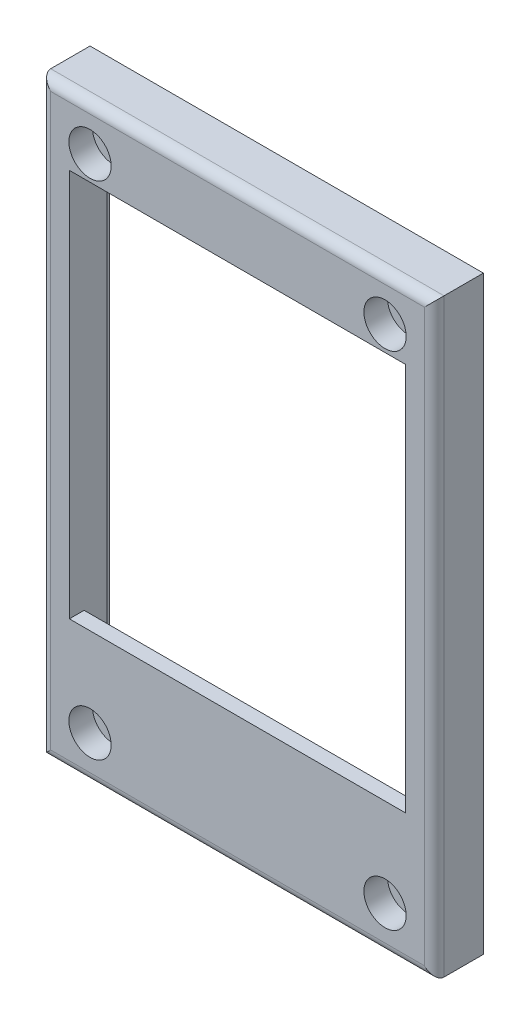
ISO-10303-21;
HEADER;
FILE_DESCRIPTION(('STEP AP214'),'2;1');
FILE_NAME('part.step','',(''),(''),'','','');
FILE_SCHEMA(('AUTOMOTIVE_DESIGN { 1 0 10303 214 1 1 1 1 }'));
ENDSEC;
DATA;
#1=APPLICATION_CONTEXT('core data for automotive mechanical design processes');
#2=APPLICATION_PROTOCOL_DEFINITION('international standard','automotive_design',2000,#1);
#3=PRODUCT_CONTEXT('',#1,'mechanical');
#4=PRODUCT('Part','Part','',(#3));
#5=PRODUCT_RELATED_PRODUCT_CATEGORY('part','',(#4));
#6=PRODUCT_DEFINITION_FORMATION('','',#4);
#7=PRODUCT_DEFINITION_CONTEXT('part definition',#1,'design');
#8=PRODUCT_DEFINITION('design','',#6,#7);
#9=PRODUCT_DEFINITION_SHAPE('','',#8);
#10=(LENGTH_UNIT() NAMED_UNIT(*) SI_UNIT(.MILLI.,.METRE.));
#11=(NAMED_UNIT(*) PLANE_ANGLE_UNIT() SI_UNIT($,.RADIAN.));
#12=(NAMED_UNIT(*) SI_UNIT($,.STERADIAN.) SOLID_ANGLE_UNIT());
#13=UNCERTAINTY_MEASURE_WITH_UNIT(LENGTH_MEASURE(1.E-05),#10,'distance_accuracy_value','');
#14=(GEOMETRIC_REPRESENTATION_CONTEXT(3) GLOBAL_UNCERTAINTY_ASSIGNED_CONTEXT((#13)) GLOBAL_UNIT_ASSIGNED_CONTEXT((#10,
#11,#12)) REPRESENTATION_CONTEXT('',''));
#15=CARTESIAN_POINT('',(0.,0.,0.));
#16=DIRECTION('',(0.,0.,1.));
#17=DIRECTION('',(1.,0.,0.));
#18=AXIS2_PLACEMENT_3D('',#15,#16,#17);
#19=CARTESIAN_POINT('',(2.9,7.,5.));
#20=DIRECTION('',(-1.,0.,0.));
#21=DIRECTION('',(0.,-1.,0.));
#22=AXIS2_PLACEMENT_3D('',#19,#20,#21);
#23=PLANE('',#22);
#24=DIRECTION('',(0.,0.,1.));
#25=VECTOR('',#24,1.);
#26=CARTESIAN_POINT('',(2.9,13.5,5.));
#27=LINE('',#26,#25);
#28=CARTESIAN_POINT('',(2.9,13.5,3.5));
#29=VERTEX_POINT('',#28);
#30=CARTESIAN_POINT('',(2.9,13.5,5.));
#31=VERTEX_POINT('',#30);
#32=EDGE_CURVE('E61',#29,#31,#27,.T.);
#33=ORIENTED_EDGE('',*,*,#32,.F.);
#34=DIRECTION('',(0.,1.,0.));
#35=VECTOR('',#34,1.);
#36=CARTESIAN_POINT('',(2.9,7.,3.5));
#37=LINE('',#36,#35);
#38=CARTESIAN_POINT('',(2.9,7.,3.5));
#39=VERTEX_POINT('',#38);
#40=EDGE_CURVE('E188',#39,#29,#37,.T.);
#41=ORIENTED_EDGE('',*,*,#40,.F.);
#42=DIRECTION('',(0.,0.,-1.));
#43=VECTOR('',#42,1.);
#44=CARTESIAN_POINT('',(2.9,7.,5.));
#45=LINE('',#44,#43);
#46=CARTESIAN_POINT('',(2.9,7.,1.2));
#47=VERTEX_POINT('',#46);
#48=EDGE_CURVE('E178',#39,#47,#45,.T.);
#49=ORIENTED_EDGE('',*,*,#48,.T.);
#50=DIRECTION('',(0.,1.,0.));
#51=VECTOR('',#50,1.);
#52=CARTESIAN_POINT('',(2.9,7.,1.2));
#53=LINE('',#52,#51);
#54=CARTESIAN_POINT('',(2.9,53.,1.2));
#55=VERTEX_POINT('',#54);
#56=EDGE_CURVE('E263',#47,#55,#53,.T.);
#57=ORIENTED_EDGE('',*,*,#56,.T.);
#58=DIRECTION('',(0.,0.,-1.));
#59=VECTOR('',#58,1.);
#60=CARTESIAN_POINT('',(2.9,53.,5.));
#61=LINE('',#60,#59);
#62=CARTESIAN_POINT('',(2.9,53.,5.));
#63=VERTEX_POINT('',#62);
#64=EDGE_CURVE('E187',#63,#55,#61,.T.);
#65=ORIENTED_EDGE('',*,*,#64,.F.);
#66=DIRECTION('',(0.,1.,0.));
#67=VECTOR('',#66,1.);
#68=CARTESIAN_POINT('',(2.9,7.,5.));
#69=LINE('',#68,#67);
#70=EDGE_CURVE('E316',#31,#63,#69,.T.);
#71=ORIENTED_EDGE('',*,*,#70,.F.);
#72=EDGE_LOOP('',(#33,#41,#49,#57,#65,#71));
#73=FACE_BOUND('',#72,.T.);
#74=ADVANCED_FACE('F39',(#73),#23,.F.);
#75=CARTESIAN_POINT('',(2.9,7.,5.));
#76=DIRECTION('',(0.,-1.,0.));
#77=DIRECTION('',(0.,0.,-1.));
#78=AXIS2_PLACEMENT_3D('',#75,#76,#77);
#79=PLANE('',#78);
#80=DIRECTION('',(-1.,0.,0.));
#81=VECTOR('',#80,1.);
#82=CARTESIAN_POINT('',(40.002,6.99999999999999,3.5));
#83=LINE('',#82,#81);
#84=CARTESIAN_POINT('',(37.1,7.,3.5));
#85=VERTEX_POINT('',#84);
#86=EDGE_CURVE('E181',#85,#39,#83,.T.);
#87=ORIENTED_EDGE('',*,*,#86,.F.);
#88=DIRECTION('',(0.,0.,-1.));
#89=VECTOR('',#88,1.);
#90=CARTESIAN_POINT('',(37.1,7.,5.));
#91=LINE('',#90,#89);
#92=CARTESIAN_POINT('',(37.1,7.,1.2));
#93=VERTEX_POINT('',#92);
#94=EDGE_CURVE('E190',#85,#93,#91,.T.);
#95=ORIENTED_EDGE('',*,*,#94,.T.);
#96=DIRECTION('',(-1.,0.,0.));
#97=VECTOR('',#96,1.);
#98=CARTESIAN_POINT('',(2.9,7.,1.2));
#99=LINE('',#98,#97);
#100=EDGE_CURVE('E182',#93,#47,#99,.T.);
#101=ORIENTED_EDGE('',*,*,#100,.T.);
#102=ORIENTED_EDGE('',*,*,#48,.F.);
#103=EDGE_LOOP('',(#87,#95,#101,#102));
#104=FACE_BOUND('',#103,.T.);
#105=ADVANCED_FACE('F177',(#104),#79,.F.);
#106=CARTESIAN_POINT('',(5.00000000000001,4.5,0.));
#107=DIRECTION('',(0.,0.,1.));
#108=DIRECTION('',(1.,0.,0.));
#109=AXIS2_PLACEMENT_3D('',#106,#107,#108);
#110=CYLINDRICAL_SURFACE('',#109,1.15);
#111=CARTESIAN_POINT('',(5.00000000000001,4.5,1.2));
#112=DIRECTION('',(0.,0.,1.));
#113=DIRECTION('',(1.,0.,0.));
#114=AXIS2_PLACEMENT_3D('',#111,#112,#113);
#115=CIRCLE('',#114,1.15);
#116=CARTESIAN_POINT('',(6.15000000000001,4.5,1.2));
#117=VERTEX_POINT('',#116);
#118=EDGE_CURVE('E289',#117,#117,#115,.F.);
#119=ORIENTED_EDGE('',*,*,#118,.T.);
#120=EDGE_LOOP('',(#119));
#121=FACE_BOUND('',#120,.T.);
#122=CARTESIAN_POINT('',(5.00000000000001,4.5,2.6));
#123=DIRECTION('',(0.,0.,1.));
#124=DIRECTION('',(1.,0.,0.));
#125=AXIS2_PLACEMENT_3D('',#122,#123,#124);
#126=CIRCLE('',#125,1.15);
#127=CARTESIAN_POINT('',(6.15000000000001,4.5,2.6));
#128=VERTEX_POINT('',#127);
#129=EDGE_CURVE('E318',#128,#128,#126,.F.);
#130=ORIENTED_EDGE('',*,*,#129,.F.);
#131=EDGE_LOOP('',(#130));
#132=FACE_BOUND('',#131,.T.);
#133=ADVANCED_FACE('F459',(#121,#132),#110,.F.);
#134=CARTESIAN_POINT('',(35.,55.5,0.));
#135=DIRECTION('',(0.,0.,1.));
#136=DIRECTION('',(1.,0.,0.));
#137=AXIS2_PLACEMENT_3D('',#134,#135,#136);
#138=CYLINDRICAL_SURFACE('',#137,1.15);
#139=CARTESIAN_POINT('',(35.,55.5,1.2));
#140=DIRECTION('',(0.,0.,1.));
#141=DIRECTION('',(1.,0.,0.));
#142=AXIS2_PLACEMENT_3D('',#139,#140,#141);
#143=CIRCLE('',#142,1.15);
#144=CARTESIAN_POINT('',(36.15,55.5,1.2));
#145=VERTEX_POINT('',#144);
#146=EDGE_CURVE('E283',#145,#145,#143,.F.);
#147=ORIENTED_EDGE('',*,*,#146,.T.);
#148=EDGE_LOOP('',(#147));
#149=FACE_BOUND('',#148,.T.);
#150=CARTESIAN_POINT('',(35.,55.5,2.6));
#151=DIRECTION('',(0.,0.,1.));
#152=DIRECTION('',(1.,0.,0.));
#153=AXIS2_PLACEMENT_3D('',#150,#151,#152);
#154=CIRCLE('',#153,1.15);
#155=CARTESIAN_POINT('',(36.15,55.5,2.6));
#156=VERTEX_POINT('',#155);
#157=EDGE_CURVE('E358',#156,#156,#154,.F.);
#158=ORIENTED_EDGE('',*,*,#157,.F.);
#159=EDGE_LOOP('',(#158));
#160=FACE_BOUND('',#159,.T.);
#161=ADVANCED_FACE('F465',(#149,#160),#138,.F.);
#162=CARTESIAN_POINT('',(5.00000000000001,55.5,0.));
#163=DIRECTION('',(0.,0.,1.));
#164=DIRECTION('',(1.,0.,0.));
#165=AXIS2_PLACEMENT_3D('',#162,#163,#164);
#166=CYLINDRICAL_SURFACE('',#165,1.15);
#167=CARTESIAN_POINT('',(5.00000000000001,55.5,1.2));
#168=DIRECTION('',(0.,0.,1.));
#169=DIRECTION('',(1.,0.,0.));
#170=AXIS2_PLACEMENT_3D('',#167,#168,#169);
#171=CIRCLE('',#170,1.15);
#172=CARTESIAN_POINT('',(6.15000000000001,55.5,1.2));
#173=VERTEX_POINT('',#172);
#174=EDGE_CURVE('E285',#173,#173,#171,.F.);
#175=ORIENTED_EDGE('',*,*,#174,.T.);
#176=EDGE_LOOP('',(#175));
#177=FACE_BOUND('',#176,.T.);
#178=CARTESIAN_POINT('',(5.00000000000001,55.5,2.6));
#179=DIRECTION('',(0.,0.,1.));
#180=DIRECTION('',(1.,0.,0.));
#181=AXIS2_PLACEMENT_3D('',#178,#179,#180);
#182=CIRCLE('',#181,1.15);
#183=CARTESIAN_POINT('',(6.15000000000001,55.5,2.6));
#184=VERTEX_POINT('',#183);
#185=EDGE_CURVE('E354',#184,#184,#182,.F.);
#186=ORIENTED_EDGE('',*,*,#185,.F.);
#187=EDGE_LOOP('',(#186));
#188=FACE_BOUND('',#187,.T.);
#189=ADVANCED_FACE('F461',(#177,#188),#166,.F.);
#190=CARTESIAN_POINT('',(35.,4.5,0.));
#191=DIRECTION('',(0.,0.,1.));
#192=DIRECTION('',(1.,0.,0.));
#193=AXIS2_PLACEMENT_3D('',#190,#191,#192);
#194=CYLINDRICAL_SURFACE('',#193,1.15);
#195=CARTESIAN_POINT('',(35.,4.5,1.2));
#196=DIRECTION('',(0.,0.,1.));
#197=DIRECTION('',(1.,0.,0.));
#198=AXIS2_PLACEMENT_3D('',#195,#196,#197);
#199=CIRCLE('',#198,1.15);
#200=CARTESIAN_POINT('',(36.15,4.5,1.2));
#201=VERTEX_POINT('',#200);
#202=EDGE_CURVE('E276',#201,#201,#199,.F.);
#203=ORIENTED_EDGE('',*,*,#202,.T.);
#204=EDGE_LOOP('',(#203));
#205=FACE_BOUND('',#204,.T.);
#206=CARTESIAN_POINT('',(35.,4.5,2.6));
#207=DIRECTION('',(0.,0.,1.));
#208=DIRECTION('',(1.,0.,0.));
#209=AXIS2_PLACEMENT_3D('',#206,#207,#208);
#210=CIRCLE('',#209,1.15);
#211=CARTESIAN_POINT('',(36.15,4.5,2.6));
#212=VERTEX_POINT('',#211);
#213=EDGE_CURVE('E312',#212,#212,#210,.F.);
#214=ORIENTED_EDGE('',*,*,#213,.F.);
#215=EDGE_LOOP('',(#214));
#216=FACE_BOUND('',#215,.T.);
#217=ADVANCED_FACE('F470',(#205,#216),#194,.F.);
#218=CARTESIAN_POINT('',(0.,0.,5.));
#219=DIRECTION('',(0.,1.,0.));
#220=DIRECTION('',(-1.,0.,0.));
#221=AXIS2_PLACEMENT_3D('',#218,#219,#220);
#222=PLANE('',#221);
#223=DIRECTION('',(0.,0.,-1.));
#224=VECTOR('',#223,1.);
#225=CARTESIAN_POINT('',(40.,0.,5.));
#226=LINE('',#225,#224);
#227=CARTESIAN_POINT('',(40.,0.,4.));
#228=VERTEX_POINT('',#227);
#229=CARTESIAN_POINT('',(40.,0.,0.));
#230=VERTEX_POINT('',#229);
#231=EDGE_CURVE('E346',#228,#230,#226,.T.);
#232=ORIENTED_EDGE('',*,*,#231,.F.);
#233=DIRECTION('',(1.,0.,0.));
#234=VECTOR('',#233,1.);
#235=CARTESIAN_POINT('',(0.,0.,4.));
#236=LINE('',#235,#234);
#237=CARTESIAN_POINT('',(0.,0.,4.));
#238=VERTEX_POINT('',#237);
#239=EDGE_CURVE('E371',#228,#238,#236,.F.);
#240=ORIENTED_EDGE('',*,*,#239,.T.);
#241=DIRECTION('',(0.,0.,-1.));
#242=VECTOR('',#241,1.);
#243=CARTESIAN_POINT('',(0.,0.,5.));
#244=LINE('',#243,#242);
#245=CARTESIAN_POINT('',(0.,0.,0.));
#246=VERTEX_POINT('',#245);
#247=EDGE_CURVE('E344',#238,#246,#244,.T.);
#248=ORIENTED_EDGE('',*,*,#247,.T.);
#249=DIRECTION('',(1.,0.,0.));
#250=VECTOR('',#249,1.);
#251=CARTESIAN_POINT('',(0.,0.,0.));
#252=LINE('',#251,#250);
#253=EDGE_CURVE('E329',#246,#230,#252,.T.);
#254=ORIENTED_EDGE('',*,*,#253,.T.);
#255=EDGE_LOOP('',(#232,#240,#248,#254));
#256=FACE_BOUND('',#255,.T.);
#257=ADVANCED_FACE('F415',(#256),#222,.F.);
#258=CARTESIAN_POINT('',(40.,0.,5.));
#259=DIRECTION('',(-1.,0.,0.));
#260=DIRECTION('',(0.,0.,1.));
#261=AXIS2_PLACEMENT_3D('',#258,#259,#260);
#262=PLANE('',#261);
#263=DIRECTION('',(0.,0.,-1.));
#264=VECTOR('',#263,1.);
#265=CARTESIAN_POINT('',(40.,60.,5.));
#266=LINE('',#265,#264);
#267=CARTESIAN_POINT('',(40.,60.,4.));
#268=VERTEX_POINT('',#267);
#269=CARTESIAN_POINT('',(40.,60.,0.));
#270=VERTEX_POINT('',#269);
#271=EDGE_CURVE('E350',#268,#270,#266,.T.);
#272=ORIENTED_EDGE('',*,*,#271,.F.);
#273=DIRECTION('',(0.,1.,0.));
#274=VECTOR('',#273,1.);
#275=CARTESIAN_POINT('',(40.,0.,4.));
#276=LINE('',#275,#274);
#277=EDGE_CURVE('E372',#268,#228,#276,.F.);
#278=ORIENTED_EDGE('',*,*,#277,.T.);
#279=ORIENTED_EDGE('',*,*,#231,.T.);
#280=DIRECTION('',(0.,1.,0.));
#281=VECTOR('',#280,1.);
#282=CARTESIAN_POINT('',(40.,0.,0.));
#283=LINE('',#282,#281);
#284=EDGE_CURVE('E331',#230,#270,#283,.T.);
#285=ORIENTED_EDGE('',*,*,#284,.T.);
#286=EDGE_LOOP('',(#272,#278,#279,#285));
#287=FACE_BOUND('',#286,.T.);
#288=ADVANCED_FACE('F398',(#287),#262,.F.);
#289=CARTESIAN_POINT('',(0.,60.,5.));
#290=DIRECTION('',(0.,-1.,0.));
#291=DIRECTION('',(1.,0.,0.));
#292=AXIS2_PLACEMENT_3D('',#289,#290,#291);
#293=PLANE('',#292);
#294=DIRECTION('',(0.,0.,-1.));
#295=VECTOR('',#294,1.);
#296=CARTESIAN_POINT('',(0.,60.,5.));
#297=LINE('',#296,#295);
#298=CARTESIAN_POINT('',(0.,60.,4.));
#299=VERTEX_POINT('',#298);
#300=CARTESIAN_POINT('',(0.,60.,0.));
#301=VERTEX_POINT('',#300);
#302=EDGE_CURVE('E343',#299,#301,#297,.T.);
#303=ORIENTED_EDGE('',*,*,#302,.F.);
#304=DIRECTION('',(-1.,0.,0.));
#305=VECTOR('',#304,1.);
#306=CARTESIAN_POINT('',(40.,60.,4.));
#307=LINE('',#306,#305);
#308=EDGE_CURVE('E48',#299,#268,#307,.F.);
#309=ORIENTED_EDGE('',*,*,#308,.T.);
#310=ORIENTED_EDGE('',*,*,#271,.T.);
#311=DIRECTION('',(-1.,0.,0.));
#312=VECTOR('',#311,1.);
#313=CARTESIAN_POINT('',(0.,60.,0.));
#314=LINE('',#313,#312);
#315=EDGE_CURVE('E340',#270,#301,#314,.T.);
#316=ORIENTED_EDGE('',*,*,#315,.T.);
#317=EDGE_LOOP('',(#303,#309,#310,#316));
#318=FACE_BOUND('',#317,.T.);
#319=ADVANCED_FACE('F399',(#318),#293,.F.);
#320=CARTESIAN_POINT('',(0.,0.,5.));
#321=DIRECTION('',(1.,0.,0.));
#322=DIRECTION('',(0.,0.,-1.));
#323=AXIS2_PLACEMENT_3D('',#320,#321,#322);
#324=PLANE('',#323);
#325=ORIENTED_EDGE('',*,*,#247,.F.);
#326=DIRECTION('',(0.,-1.,0.));
#327=VECTOR('',#326,1.);
#328=CARTESIAN_POINT('',(0.,60.,4.));
#329=LINE('',#328,#327);
#330=EDGE_CURVE('E11',#238,#299,#329,.F.);
#331=ORIENTED_EDGE('',*,*,#330,.T.);
#332=ORIENTED_EDGE('',*,*,#302,.T.);
#333=DIRECTION('',(0.,-1.,0.));
#334=VECTOR('',#333,1.);
#335=CARTESIAN_POINT('',(0.,0.,0.));
#336=LINE('',#335,#334);
#337=EDGE_CURVE('E338',#301,#246,#336,.T.);
#338=ORIENTED_EDGE('',*,*,#337,.T.);
#339=EDGE_LOOP('',(#325,#331,#332,#338));
#340=FACE_BOUND('',#339,.T.);
#341=ADVANCED_FACE('F408',(#340),#324,.F.);
#342=CARTESIAN_POINT('',(0.,0.,5.));
#343=DIRECTION('',(0.,0.,1.));
#344=DIRECTION('',(1.,0.,0.));
#345=AXIS2_PLACEMENT_3D('',#342,#343,#344);
#346=PLANE('',#345);
#347=DIRECTION('',(0.,-1.,0.));
#348=VECTOR('',#347,1.);
#349=CARTESIAN_POINT('',(1.,0.,5.));
#350=LINE('',#349,#348);
#351=CARTESIAN_POINT('',(1.,59.,5.));
#352=VERTEX_POINT('',#351);
#353=CARTESIAN_POINT('',(1.,1.,5.));
#354=VERTEX_POINT('',#353);
#355=EDGE_CURVE('E365',#352,#354,#350,.T.);
#356=ORIENTED_EDGE('',*,*,#355,.T.);
#357=DIRECTION('',(1.,0.,0.));
#358=VECTOR('',#357,1.);
#359=CARTESIAN_POINT('',(40.,1.00000000000001,5.));
#360=LINE('',#359,#358);
#361=CARTESIAN_POINT('',(39.,1.,5.));
#362=VERTEX_POINT('',#361);
#363=EDGE_CURVE('E368',#354,#362,#360,.T.);
#364=ORIENTED_EDGE('',*,*,#363,.T.);
#365=DIRECTION('',(0.,1.,0.));
#366=VECTOR('',#365,1.);
#367=CARTESIAN_POINT('',(39.,60.,5.));
#368=LINE('',#367,#366);
#369=CARTESIAN_POINT('',(39.,59.,5.));
#370=VERTEX_POINT('',#369);
#371=EDGE_CURVE('E366',#362,#370,#368,.T.);
#372=ORIENTED_EDGE('',*,*,#371,.T.);
#373=DIRECTION('',(-1.,0.,0.));
#374=VECTOR('',#373,1.);
#375=CARTESIAN_POINT('',(0.,59.,5.));
#376=LINE('',#375,#374);
#377=EDGE_CURVE('E364',#370,#352,#376,.T.);
#378=ORIENTED_EDGE('',*,*,#377,.T.);
#379=EDGE_LOOP('',(#356,#364,#372,#378));
#380=FACE_BOUND('',#379,.T.);
#381=CARTESIAN_POINT('',(35.,55.5,5.));
#382=DIRECTION('',(0.,0.,1.));
#383=DIRECTION('',(1.,0.,0.));
#384=AXIS2_PLACEMENT_3D('',#381,#382,#383);
#385=CIRCLE('',#384,2.15);
#386=CARTESIAN_POINT('',(37.15,55.5,5.));
#387=VERTEX_POINT('',#386);
#388=EDGE_CURVE('E296',#387,#387,#385,.T.);
#389=ORIENTED_EDGE('',*,*,#388,.F.);
#390=EDGE_LOOP('',(#389));
#391=FACE_BOUND('',#390,.T.);
#392=CARTESIAN_POINT('',(5.00000000000001,4.5,5.));
#393=DIRECTION('',(0.,0.,1.));
#394=DIRECTION('',(1.,0.,0.));
#395=AXIS2_PLACEMENT_3D('',#392,#393,#394);
#396=CIRCLE('',#395,2.15);
#397=CARTESIAN_POINT('',(7.15000000000001,4.5,5.));
#398=VERTEX_POINT('',#397);
#399=EDGE_CURVE('E304',#398,#398,#396,.T.);
#400=ORIENTED_EDGE('',*,*,#399,.F.);
#401=EDGE_LOOP('',(#400));
#402=FACE_BOUND('',#401,.T.);
#403=CARTESIAN_POINT('',(35.,4.5,5.));
#404=DIRECTION('',(0.,0.,1.));
#405=DIRECTION('',(1.,0.,0.));
#406=AXIS2_PLACEMENT_3D('',#403,#404,#405);
#407=CIRCLE('',#406,2.15);
#408=CARTESIAN_POINT('',(37.15,4.5,5.));
#409=VERTEX_POINT('',#408);
#410=EDGE_CURVE('E292',#409,#409,#407,.T.);
#411=ORIENTED_EDGE('',*,*,#410,.F.);
#412=EDGE_LOOP('',(#411));
#413=FACE_BOUND('',#412,.T.);
#414=CARTESIAN_POINT('',(5.00000000000001,55.5,5.));
#415=DIRECTION('',(0.,0.,1.));
#416=DIRECTION('',(1.,0.,0.));
#417=AXIS2_PLACEMENT_3D('',#414,#415,#416);
#418=CIRCLE('',#417,2.15);
#419=CARTESIAN_POINT('',(7.15000000000001,55.5,5.));
#420=VERTEX_POINT('',#419);
#421=EDGE_CURVE('E301',#420,#420,#418,.T.);
#422=ORIENTED_EDGE('',*,*,#421,.F.);
#423=EDGE_LOOP('',(#422));
#424=FACE_BOUND('',#423,.T.);
#425=DIRECTION('',(0.,-1.,0.));
#426=VECTOR('',#425,1.);
#427=CARTESIAN_POINT('',(37.1,7.,5.));
#428=LINE('',#427,#426);
#429=CARTESIAN_POINT('',(37.1,53.,5.));
#430=VERTEX_POINT('',#429);
#431=CARTESIAN_POINT('',(37.1,13.5,5.));
#432=VERTEX_POINT('',#431);
#433=EDGE_CURVE('E317',#430,#432,#428,.T.);
#434=ORIENTED_EDGE('',*,*,#433,.T.);
#435=DIRECTION('',(-1.,0.,0.));
#436=VECTOR('',#435,1.);
#437=CARTESIAN_POINT('',(40.002,13.5,5.));
#438=LINE('',#437,#436);
#439=EDGE_CURVE('E199',#432,#31,#438,.T.);
#440=ORIENTED_EDGE('',*,*,#439,.T.);
#441=ORIENTED_EDGE('',*,*,#70,.T.);
#442=DIRECTION('',(1.,0.,0.));
#443=VECTOR('',#442,1.);
#444=CARTESIAN_POINT('',(2.9,53.,5.));
#445=LINE('',#444,#443);
#446=EDGE_CURVE('E325',#63,#430,#445,.T.);
#447=ORIENTED_EDGE('',*,*,#446,.T.);
#448=EDGE_LOOP('',(#434,#440,#441,#447));
#449=FACE_BOUND('',#448,.T.);
#450=ADVANCED_FACE('F418',(#380,#391,#402,#413,#424,#449),#346,.T.);
#451=CARTESIAN_POINT('',(0.,0.,0.));
#452=DIRECTION('',(0.,0.,1.));
#453=DIRECTION('',(1.,0.,0.));
#454=AXIS2_PLACEMENT_3D('',#451,#452,#453);
#455=PLANE('',#454);
#456=DIRECTION('',(1.,0.,0.));
#457=VECTOR('',#456,1.);
#458=CARTESIAN_POINT('',(38.,58.25,0.));
#459=LINE('',#458,#457);
#460=CARTESIAN_POINT('',(2.00000000000001,58.25,0.));
#461=VERTEX_POINT('',#460);
#462=CARTESIAN_POINT('',(38.,58.25,0.));
#463=VERTEX_POINT('',#462);
#464=EDGE_CURVE('E253',#461,#463,#459,.T.);
#465=ORIENTED_EDGE('',*,*,#464,.F.);
#466=DIRECTION('',(0.,1.,0.));
#467=VECTOR('',#466,1.);
#468=CARTESIAN_POINT('',(2.,1.75000000000001,0.));
#469=LINE('',#468,#467);
#470=CARTESIAN_POINT('',(2.,1.75000000000001,0.));
#471=VERTEX_POINT('',#470);
#472=EDGE_CURVE('E231',#471,#461,#469,.T.);
#473=ORIENTED_EDGE('',*,*,#472,.F.);
#474=DIRECTION('',(-1.,0.,0.));
#475=VECTOR('',#474,1.);
#476=CARTESIAN_POINT('',(38.,1.75,0.));
#477=LINE('',#476,#475);
#478=CARTESIAN_POINT('',(38.,1.75,0.));
#479=VERTEX_POINT('',#478);
#480=EDGE_CURVE('E242',#479,#471,#477,.T.);
#481=ORIENTED_EDGE('',*,*,#480,.F.);
#482=DIRECTION('',(0.,-1.,0.));
#483=VECTOR('',#482,1.);
#484=CARTESIAN_POINT('',(38.,1.75,0.));
#485=LINE('',#484,#483);
#486=EDGE_CURVE('E259',#463,#479,#485,.T.);
#487=ORIENTED_EDGE('',*,*,#486,.F.);
#488=EDGE_LOOP('',(#465,#473,#481,#487));
#489=FACE_BOUND('',#488,.T.);
#490=ORIENTED_EDGE('',*,*,#253,.F.);
#491=ORIENTED_EDGE('',*,*,#337,.F.);
#492=ORIENTED_EDGE('',*,*,#315,.F.);
#493=ORIENTED_EDGE('',*,*,#284,.F.);
#494=EDGE_LOOP('',(#490,#491,#492,#493));
#495=FACE_BOUND('',#494,.T.);
#496=ADVANCED_FACE('F410',(#489,#495),#455,.F.);
#497=CARTESIAN_POINT('',(37.1,7.,5.));
#498=DIRECTION('',(1.,0.,0.));
#499=DIRECTION('',(0.,1.,0.));
#500=AXIS2_PLACEMENT_3D('',#497,#498,#499);
#501=PLANE('',#500);
#502=ORIENTED_EDGE('',*,*,#94,.F.);
#503=DIRECTION('',(0.,1.,0.));
#504=VECTOR('',#503,1.);
#505=CARTESIAN_POINT('',(37.1,7.,3.5));
#506=LINE('',#505,#504);
#507=CARTESIAN_POINT('',(37.1,13.5,3.5));
#508=VERTEX_POINT('',#507);
#509=EDGE_CURVE('E57',#85,#508,#506,.T.);
#510=ORIENTED_EDGE('',*,*,#509,.T.);
#511=DIRECTION('',(0.,0.,1.));
#512=VECTOR('',#511,1.);
#513=CARTESIAN_POINT('',(37.1,13.5,5.));
#514=LINE('',#513,#512);
#515=EDGE_CURVE('E198',#508,#432,#514,.T.);
#516=ORIENTED_EDGE('',*,*,#515,.T.);
#517=ORIENTED_EDGE('',*,*,#433,.F.);
#518=DIRECTION('',(0.,0.,-1.));
#519=VECTOR('',#518,1.);
#520=CARTESIAN_POINT('',(37.1,53.,5.));
#521=LINE('',#520,#519);
#522=CARTESIAN_POINT('',(37.1,53.,1.2));
#523=VERTEX_POINT('',#522);
#524=EDGE_CURVE('E323',#430,#523,#521,.T.);
#525=ORIENTED_EDGE('',*,*,#524,.T.);
#526=DIRECTION('',(0.,-1.,0.));
#527=VECTOR('',#526,1.);
#528=CARTESIAN_POINT('',(37.1,7.,1.2));
#529=LINE('',#528,#527);
#530=EDGE_CURVE('E277',#523,#93,#529,.T.);
#531=ORIENTED_EDGE('',*,*,#530,.T.);
#532=EDGE_LOOP('',(#502,#510,#516,#517,#525,#531));
#533=FACE_BOUND('',#532,.T.);
#534=ADVANCED_FACE('F440',(#533),#501,.F.);
#535=CARTESIAN_POINT('',(2.9,53.,5.));
#536=DIRECTION('',(0.,1.,0.));
#537=DIRECTION('',(0.,0.,1.));
#538=AXIS2_PLACEMENT_3D('',#535,#536,#537);
#539=PLANE('',#538);
#540=ORIENTED_EDGE('',*,*,#64,.T.);
#541=DIRECTION('',(1.,0.,0.));
#542=VECTOR('',#541,1.);
#543=CARTESIAN_POINT('',(2.9,53.,1.2));
#544=LINE('',#543,#542);
#545=EDGE_CURVE('E271',#55,#523,#544,.T.);
#546=ORIENTED_EDGE('',*,*,#545,.T.);
#547=ORIENTED_EDGE('',*,*,#524,.F.);
#548=ORIENTED_EDGE('',*,*,#446,.F.);
#549=EDGE_LOOP('',(#540,#546,#547,#548));
#550=FACE_BOUND('',#549,.T.);
#551=ADVANCED_FACE('F437',(#550),#539,.F.);
#552=CARTESIAN_POINT('',(35.,4.5,2.6));
#553=DIRECTION('',(0.,0.,1.));
#554=DIRECTION('',(1.,0.,0.));
#555=AXIS2_PLACEMENT_3D('',#552,#553,#554);
#556=PLANE('',#555);
#557=CARTESIAN_POINT('',(35.,4.5,2.6));
#558=DIRECTION('',(0.,0.,1.));
#559=DIRECTION('',(1.,0.,0.));
#560=AXIS2_PLACEMENT_3D('',#557,#558,#559);
#561=CIRCLE('',#560,2.15);
#562=CARTESIAN_POINT('',(37.15,4.5,2.6));
#563=VERTEX_POINT('',#562);
#564=EDGE_CURVE('E293',#563,#563,#561,.T.);
#565=ORIENTED_EDGE('',*,*,#564,.T.);
#566=EDGE_LOOP('',(#565));
#567=FACE_BOUND('',#566,.T.);
#568=ORIENTED_EDGE('',*,*,#213,.T.);
#569=EDGE_LOOP('',(#568));
#570=FACE_BOUND('',#569,.T.);
#571=ADVANCED_FACE('F444',(#567,#570),#556,.T.);
#572=CARTESIAN_POINT('',(35.,4.5,2.6));
#573=DIRECTION('',(0.,0.,1.));
#574=DIRECTION('',(1.,0.,0.));
#575=AXIS2_PLACEMENT_3D('',#572,#573,#574);
#576=CYLINDRICAL_SURFACE('',#575,2.15);
#577=ORIENTED_EDGE('',*,*,#564,.F.);
#578=EDGE_LOOP('',(#577));
#579=FACE_BOUND('',#578,.T.);
#580=ORIENTED_EDGE('',*,*,#410,.T.);
#581=EDGE_LOOP('',(#580));
#582=FACE_BOUND('',#581,.T.);
#583=ADVANCED_FACE('F484',(#579,#582),#576,.F.);
#584=CARTESIAN_POINT('',(5.00000000000001,55.5,2.6));
#585=DIRECTION('',(0.,0.,1.));
#586=DIRECTION('',(1.,0.,0.));
#587=AXIS2_PLACEMENT_3D('',#584,#585,#586);
#588=PLANE('',#587);
#589=CARTESIAN_POINT('',(5.00000000000001,55.5,2.6));
#590=DIRECTION('',(0.,0.,1.));
#591=DIRECTION('',(1.,0.,0.));
#592=AXIS2_PLACEMENT_3D('',#589,#590,#591);
#593=CIRCLE('',#592,2.15);
#594=CARTESIAN_POINT('',(7.15000000000001,55.5,2.6));
#595=VERTEX_POINT('',#594);
#596=EDGE_CURVE('E309',#595,#595,#593,.T.);
#597=ORIENTED_EDGE('',*,*,#596,.T.);
#598=EDGE_LOOP('',(#597));
#599=FACE_BOUND('',#598,.T.);
#600=ORIENTED_EDGE('',*,*,#185,.T.);
#601=EDGE_LOOP('',(#600));
#602=FACE_BOUND('',#601,.T.);
#603=ADVANCED_FACE('F476',(#599,#602),#588,.T.);
#604=CARTESIAN_POINT('',(5.00000000000001,55.5,2.6));
#605=DIRECTION('',(0.,0.,1.));
#606=DIRECTION('',(1.,0.,0.));
#607=AXIS2_PLACEMENT_3D('',#604,#605,#606);
#608=CYLINDRICAL_SURFACE('',#607,2.15);
#609=ORIENTED_EDGE('',*,*,#596,.F.);
#610=EDGE_LOOP('',(#609));
#611=FACE_BOUND('',#610,.T.);
#612=ORIENTED_EDGE('',*,*,#421,.T.);
#613=EDGE_LOOP('',(#612));
#614=FACE_BOUND('',#613,.T.);
#615=ADVANCED_FACE('F473',(#611,#614),#608,.F.);
#616=CARTESIAN_POINT('',(35.,55.5,2.6));
#617=DIRECTION('',(0.,0.,1.));
#618=DIRECTION('',(1.,0.,0.));
#619=AXIS2_PLACEMENT_3D('',#616,#617,#618);
#620=PLANE('',#619);
#621=CARTESIAN_POINT('',(35.,55.5,2.6));
#622=DIRECTION('',(0.,0.,1.));
#623=DIRECTION('',(1.,0.,0.));
#624=AXIS2_PLACEMENT_3D('',#621,#622,#623);
#625=CIRCLE('',#624,2.15);
#626=CARTESIAN_POINT('',(37.15,55.5,2.6));
#627=VERTEX_POINT('',#626);
#628=EDGE_CURVE('E305',#627,#627,#625,.T.);
#629=ORIENTED_EDGE('',*,*,#628,.T.);
#630=EDGE_LOOP('',(#629));
#631=FACE_BOUND('',#630,.T.);
#632=ORIENTED_EDGE('',*,*,#157,.T.);
#633=EDGE_LOOP('',(#632));
#634=FACE_BOUND('',#633,.T.);
#635=ADVANCED_FACE('F479',(#631,#634),#620,.T.);
#636=CARTESIAN_POINT('',(35.,55.5,2.6));
#637=DIRECTION('',(0.,0.,1.));
#638=DIRECTION('',(1.,0.,0.));
#639=AXIS2_PLACEMENT_3D('',#636,#637,#638);
#640=CYLINDRICAL_SURFACE('',#639,2.15);
#641=ORIENTED_EDGE('',*,*,#628,.F.);
#642=EDGE_LOOP('',(#641));
#643=FACE_BOUND('',#642,.T.);
#644=ORIENTED_EDGE('',*,*,#388,.T.);
#645=EDGE_LOOP('',(#644));
#646=FACE_BOUND('',#645,.T.);
#647=ADVANCED_FACE('F490',(#643,#646),#640,.F.);
#648=CARTESIAN_POINT('',(5.00000000000001,4.5,2.6));
#649=DIRECTION('',(0.,0.,1.));
#650=DIRECTION('',(1.,0.,0.));
#651=AXIS2_PLACEMENT_3D('',#648,#649,#650);
#652=PLANE('',#651);
#653=CARTESIAN_POINT('',(5.00000000000001,4.5,2.6));
#654=DIRECTION('',(0.,0.,1.));
#655=DIRECTION('',(1.,0.,0.));
#656=AXIS2_PLACEMENT_3D('',#653,#654,#655);
#657=CIRCLE('',#656,2.15);
#658=CARTESIAN_POINT('',(7.15000000000001,4.5,2.6));
#659=VERTEX_POINT('',#658);
#660=EDGE_CURVE('E294',#659,#659,#657,.T.);
#661=ORIENTED_EDGE('',*,*,#660,.T.);
#662=EDGE_LOOP('',(#661));
#663=FACE_BOUND('',#662,.T.);
#664=ORIENTED_EDGE('',*,*,#129,.T.);
#665=EDGE_LOOP('',(#664));
#666=FACE_BOUND('',#665,.T.);
#667=ADVANCED_FACE('F483',(#663,#666),#652,.T.);
#668=CARTESIAN_POINT('',(5.00000000000001,4.5,2.6));
#669=DIRECTION('',(0.,0.,1.));
#670=DIRECTION('',(1.,0.,0.));
#671=AXIS2_PLACEMENT_3D('',#668,#669,#670);
#672=CYLINDRICAL_SURFACE('',#671,2.15);
#673=ORIENTED_EDGE('',*,*,#660,.F.);
#674=EDGE_LOOP('',(#673));
#675=FACE_BOUND('',#674,.T.);
#676=ORIENTED_EDGE('',*,*,#399,.T.);
#677=EDGE_LOOP('',(#676));
#678=FACE_BOUND('',#677,.T.);
#679=ADVANCED_FACE('F486',(#675,#678),#672,.F.);
#680=CARTESIAN_POINT('',(0.,0.,1.2));
#681=DIRECTION('',(0.,0.,1.));
#682=DIRECTION('',(1.,0.,0.));
#683=AXIS2_PLACEMENT_3D('',#680,#681,#682);
#684=PLANE('',#683);
#685=DIRECTION('',(1.,0.,0.));
#686=VECTOR('',#685,1.);
#687=CARTESIAN_POINT('',(32.5,57.125,1.2));
#688=LINE('',#687,#686);
#689=CARTESIAN_POINT('',(7.50000000000002,57.125,1.2));
#690=VERTEX_POINT('',#689);
#691=CARTESIAN_POINT('',(32.5,57.125,1.2));
#692=VERTEX_POINT('',#691);
#693=EDGE_CURVE('E224',#690,#692,#688,.T.);
#694=ORIENTED_EDGE('',*,*,#693,.F.);
#695=DIRECTION('',(0.,1.,0.));
#696=VECTOR('',#695,1.);
#697=CARTESIAN_POINT('',(7.50000000000002,54.125,1.2));
#698=LINE('',#697,#696);
#699=CARTESIAN_POINT('',(7.50000000000002,54.125,1.2));
#700=VERTEX_POINT('',#699);
#701=EDGE_CURVE('E222',#700,#690,#698,.T.);
#702=ORIENTED_EDGE('',*,*,#701,.F.);
#703=DIRECTION('',(-1.,0.,0.));
#704=VECTOR('',#703,1.);
#705=CARTESIAN_POINT('',(32.5,54.125,1.2));
#706=LINE('',#705,#704);
#707=CARTESIAN_POINT('',(32.5,54.125,1.2));
#708=VERTEX_POINT('',#707);
#709=EDGE_CURVE('E212',#708,#700,#706,.T.);
#710=ORIENTED_EDGE('',*,*,#709,.F.);
#711=DIRECTION('',(0.,-1.,0.));
#712=VECTOR('',#711,1.);
#713=CARTESIAN_POINT('',(32.5,54.125,1.2));
#714=LINE('',#713,#712);
#715=EDGE_CURVE('E228',#692,#708,#714,.T.);
#716=ORIENTED_EDGE('',*,*,#715,.F.);
#717=EDGE_LOOP('',(#694,#702,#710,#716));
#718=FACE_BOUND('',#717,.T.);
#719=ORIENTED_EDGE('',*,*,#146,.F.);
#720=EDGE_LOOP('',(#719));
#721=FACE_BOUND('',#720,.T.);
#722=ORIENTED_EDGE('',*,*,#202,.F.);
#723=EDGE_LOOP('',(#722));
#724=FACE_BOUND('',#723,.T.);
#725=DIRECTION('',(0.,1.,0.));
#726=VECTOR('',#725,1.);
#727=CARTESIAN_POINT('',(2.,1.75000000000001,1.2));
#728=LINE('',#727,#726);
#729=CARTESIAN_POINT('',(2.,1.75000000000001,1.2));
#730=VERTEX_POINT('',#729);
#731=CARTESIAN_POINT('',(2.00000000000001,58.25,1.2));
#732=VERTEX_POINT('',#731);
#733=EDGE_CURVE('E239',#730,#732,#728,.T.);
#734=ORIENTED_EDGE('',*,*,#733,.T.);
#735=DIRECTION('',(1.,0.,0.));
#736=VECTOR('',#735,1.);
#737=CARTESIAN_POINT('',(38.,58.25,1.2));
#738=LINE('',#737,#736);
#739=CARTESIAN_POINT('',(38.,58.25,1.2));
#740=VERTEX_POINT('',#739);
#741=EDGE_CURVE('E243',#732,#740,#738,.T.);
#742=ORIENTED_EDGE('',*,*,#741,.T.);
#743=DIRECTION('',(0.,-1.,0.));
#744=VECTOR('',#743,1.);
#745=CARTESIAN_POINT('',(38.,1.75,1.2));
#746=LINE('',#745,#744);
#747=CARTESIAN_POINT('',(38.,1.75,1.2));
#748=VERTEX_POINT('',#747);
#749=EDGE_CURVE('E250',#740,#748,#746,.T.);
#750=ORIENTED_EDGE('',*,*,#749,.T.);
#751=DIRECTION('',(-1.,0.,0.));
#752=VECTOR('',#751,1.);
#753=CARTESIAN_POINT('',(38.,1.75,1.2));
#754=LINE('',#753,#752);
#755=EDGE_CURVE('E249',#748,#730,#754,.T.);
#756=ORIENTED_EDGE('',*,*,#755,.T.);
#757=EDGE_LOOP('',(#734,#742,#750,#756));
#758=FACE_BOUND('',#757,.T.);
#759=ORIENTED_EDGE('',*,*,#545,.F.);
#760=ORIENTED_EDGE('',*,*,#56,.F.);
#761=ORIENTED_EDGE('',*,*,#100,.F.);
#762=ORIENTED_EDGE('',*,*,#530,.F.);
#763=EDGE_LOOP('',(#759,#760,#761,#762));
#764=FACE_BOUND('',#763,.T.);
#765=ORIENTED_EDGE('',*,*,#174,.F.);
#766=EDGE_LOOP('',(#765));
#767=FACE_BOUND('',#766,.T.);
#768=ORIENTED_EDGE('',*,*,#118,.F.);
#769=EDGE_LOOP('',(#768));
#770=FACE_BOUND('',#769,.T.);
#771=ADVANCED_FACE('F491',(#718,#721,#724,#758,#764,#767,#770),#684,.F.);
#772=CARTESIAN_POINT('',(2.,1.75000000000001,1.2));
#773=DIRECTION('',(-1.,0.,0.));
#774=DIRECTION('',(0.,-1.,0.));
#775=AXIS2_PLACEMENT_3D('',#772,#773,#774);
#776=PLANE('',#775);
#777=ORIENTED_EDGE('',*,*,#472,.T.);
#778=DIRECTION('',(0.,0.,-1.));
#779=VECTOR('',#778,1.);
#780=CARTESIAN_POINT('',(2.00000000000001,58.25,1.2));
#781=LINE('',#780,#779);
#782=EDGE_CURVE('E254',#732,#461,#781,.T.);
#783=ORIENTED_EDGE('',*,*,#782,.F.);
#784=ORIENTED_EDGE('',*,*,#733,.F.);
#785=DIRECTION('',(0.,0.,-1.));
#786=VECTOR('',#785,1.);
#787=CARTESIAN_POINT('',(2.,1.75000000000001,1.2));
#788=LINE('',#787,#786);
#789=EDGE_CURVE('E264',#730,#471,#788,.T.);
#790=ORIENTED_EDGE('',*,*,#789,.T.);
#791=EDGE_LOOP('',(#777,#783,#784,#790));
#792=FACE_BOUND('',#791,.T.);
#793=ADVANCED_FACE('F510',(#792),#776,.F.);
#794=CARTESIAN_POINT('',(38.,1.75,1.2));
#795=DIRECTION('',(0.,-1.,0.));
#796=DIRECTION('',(1.,0.,0.));
#797=AXIS2_PLACEMENT_3D('',#794,#795,#796);
#798=PLANE('',#797);
#799=ORIENTED_EDGE('',*,*,#480,.T.);
#800=ORIENTED_EDGE('',*,*,#789,.F.);
#801=ORIENTED_EDGE('',*,*,#755,.F.);
#802=DIRECTION('',(0.,0.,-1.));
#803=VECTOR('',#802,1.);
#804=CARTESIAN_POINT('',(38.,1.75,1.2));
#805=LINE('',#804,#803);
#806=EDGE_CURVE('E267',#748,#479,#805,.T.);
#807=ORIENTED_EDGE('',*,*,#806,.T.);
#808=EDGE_LOOP('',(#799,#800,#801,#807));
#809=FACE_BOUND('',#808,.T.);
#810=ADVANCED_FACE('F509',(#809),#798,.F.);
#811=CARTESIAN_POINT('',(38.,1.75,1.2));
#812=DIRECTION('',(1.,0.,0.));
#813=DIRECTION('',(0.,1.,0.));
#814=AXIS2_PLACEMENT_3D('',#811,#812,#813);
#815=PLANE('',#814);
#816=ORIENTED_EDGE('',*,*,#486,.T.);
#817=ORIENTED_EDGE('',*,*,#806,.F.);
#818=ORIENTED_EDGE('',*,*,#749,.F.);
#819=DIRECTION('',(0.,0.,-1.));
#820=VECTOR('',#819,1.);
#821=CARTESIAN_POINT('',(38.,58.25,1.2));
#822=LINE('',#821,#820);
#823=EDGE_CURVE('E269',#740,#463,#822,.T.);
#824=ORIENTED_EDGE('',*,*,#823,.T.);
#825=EDGE_LOOP('',(#816,#817,#818,#824));
#826=FACE_BOUND('',#825,.T.);
#827=ADVANCED_FACE('F517',(#826),#815,.F.);
#828=CARTESIAN_POINT('',(38.,58.25,1.2));
#829=DIRECTION('',(0.,1.,0.));
#830=DIRECTION('',(-1.,0.,0.));
#831=AXIS2_PLACEMENT_3D('',#828,#829,#830);
#832=PLANE('',#831);
#833=ORIENTED_EDGE('',*,*,#464,.T.);
#834=ORIENTED_EDGE('',*,*,#823,.F.);
#835=ORIENTED_EDGE('',*,*,#741,.F.);
#836=ORIENTED_EDGE('',*,*,#782,.T.);
#837=EDGE_LOOP('',(#833,#834,#835,#836));
#838=FACE_BOUND('',#837,.T.);
#839=ADVANCED_FACE('F515',(#838),#832,.F.);
#840=CARTESIAN_POINT('',(7.50000000000002,54.125,3.7));
#841=DIRECTION('',(-1.,0.,0.));
#842=DIRECTION('',(0.,0.,1.));
#843=AXIS2_PLACEMENT_3D('',#840,#841,#842);
#844=PLANE('',#843);
#845=ORIENTED_EDGE('',*,*,#701,.T.);
#846=DIRECTION('',(0.,0.,-1.));
#847=VECTOR('',#846,1.);
#848=CARTESIAN_POINT('',(7.50000000000002,57.125,3.7));
#849=LINE('',#848,#847);
#850=CARTESIAN_POINT('',(7.50000000000002,57.125,3.7));
#851=VERTEX_POINT('',#850);
#852=EDGE_CURVE('E218',#851,#690,#849,.T.);
#853=ORIENTED_EDGE('',*,*,#852,.F.);
#854=DIRECTION('',(0.,1.,0.));
#855=VECTOR('',#854,1.);
#856=CARTESIAN_POINT('',(7.50000000000002,54.125,3.7));
#857=LINE('',#856,#855);
#858=CARTESIAN_POINT('',(7.50000000000002,54.125,3.7));
#859=VERTEX_POINT('',#858);
#860=EDGE_CURVE('E210',#859,#851,#857,.T.);
#861=ORIENTED_EDGE('',*,*,#860,.F.);
#862=DIRECTION('',(0.,0.,-1.));
#863=VECTOR('',#862,1.);
#864=CARTESIAN_POINT('',(7.50000000000002,54.125,3.7));
#865=LINE('',#864,#863);
#866=EDGE_CURVE('E233',#859,#700,#865,.T.);
#867=ORIENTED_EDGE('',*,*,#866,.T.);
#868=EDGE_LOOP('',(#845,#853,#861,#867));
#869=FACE_BOUND('',#868,.T.);
#870=ADVANCED_FACE('F513',(#869),#844,.F.);
#871=CARTESIAN_POINT('',(32.5,54.125,3.7));
#872=DIRECTION('',(0.,-1.,0.));
#873=DIRECTION('',(1.,0.,0.));
#874=AXIS2_PLACEMENT_3D('',#871,#872,#873);
#875=PLANE('',#874);
#876=ORIENTED_EDGE('',*,*,#709,.T.);
#877=ORIENTED_EDGE('',*,*,#866,.F.);
#878=DIRECTION('',(-1.,0.,0.));
#879=VECTOR('',#878,1.);
#880=CARTESIAN_POINT('',(32.5,54.125,3.7));
#881=LINE('',#880,#879);
#882=CARTESIAN_POINT('',(32.5,54.125,3.7));
#883=VERTEX_POINT('',#882);
#884=EDGE_CURVE('E220',#883,#859,#881,.T.);
#885=ORIENTED_EDGE('',*,*,#884,.F.);
#886=DIRECTION('',(0.,0.,-1.));
#887=VECTOR('',#886,1.);
#888=CARTESIAN_POINT('',(32.5,54.125,3.7));
#889=LINE('',#888,#887);
#890=EDGE_CURVE('E234',#883,#708,#889,.T.);
#891=ORIENTED_EDGE('',*,*,#890,.T.);
#892=EDGE_LOOP('',(#876,#877,#885,#891));
#893=FACE_BOUND('',#892,.T.);
#894=ADVANCED_FACE('F526',(#893),#875,.F.);
#895=CARTESIAN_POINT('',(32.5,54.125,3.7));
#896=DIRECTION('',(1.,0.,0.));
#897=DIRECTION('',(0.,1.,0.));
#898=AXIS2_PLACEMENT_3D('',#895,#896,#897);
#899=PLANE('',#898);
#900=ORIENTED_EDGE('',*,*,#715,.T.);
#901=ORIENTED_EDGE('',*,*,#890,.F.);
#902=DIRECTION('',(0.,-1.,0.));
#903=VECTOR('',#902,1.);
#904=CARTESIAN_POINT('',(32.5,54.125,3.7));
#905=LINE('',#904,#903);
#906=CARTESIAN_POINT('',(32.5,57.125,3.7));
#907=VERTEX_POINT('',#906);
#908=EDGE_CURVE('E211',#907,#883,#905,.T.);
#909=ORIENTED_EDGE('',*,*,#908,.F.);
#910=DIRECTION('',(0.,0.,-1.));
#911=VECTOR('',#910,1.);
#912=CARTESIAN_POINT('',(32.5,57.125,3.7));
#913=LINE('',#912,#911);
#914=EDGE_CURVE('E236',#907,#692,#913,.T.);
#915=ORIENTED_EDGE('',*,*,#914,.T.);
#916=EDGE_LOOP('',(#900,#901,#909,#915));
#917=FACE_BOUND('',#916,.T.);
#918=ADVANCED_FACE('F533',(#917),#899,.F.);
#919=CARTESIAN_POINT('',(32.5,57.125,3.7));
#920=DIRECTION('',(0.,1.,0.));
#921=DIRECTION('',(0.,0.,1.));
#922=AXIS2_PLACEMENT_3D('',#919,#920,#921);
#923=PLANE('',#922);
#924=ORIENTED_EDGE('',*,*,#693,.T.);
#925=ORIENTED_EDGE('',*,*,#914,.F.);
#926=DIRECTION('',(1.,0.,0.));
#927=VECTOR('',#926,1.);
#928=CARTESIAN_POINT('',(32.5,57.125,3.7));
#929=LINE('',#928,#927);
#930=EDGE_CURVE('E208',#851,#907,#929,.T.);
#931=ORIENTED_EDGE('',*,*,#930,.F.);
#932=ORIENTED_EDGE('',*,*,#852,.T.);
#933=EDGE_LOOP('',(#924,#925,#931,#932));
#934=FACE_BOUND('',#933,.T.);
#935=ADVANCED_FACE('F532',(#934),#923,.F.);
#936=CARTESIAN_POINT('',(0.,0.,3.7));
#937=DIRECTION('',(0.,0.,1.));
#938=DIRECTION('',(1.,0.,0.));
#939=AXIS2_PLACEMENT_3D('',#936,#937,#938);
#940=PLANE('',#939);
#941=ORIENTED_EDGE('',*,*,#860,.T.);
#942=ORIENTED_EDGE('',*,*,#930,.T.);
#943=ORIENTED_EDGE('',*,*,#908,.T.);
#944=ORIENTED_EDGE('',*,*,#884,.T.);
#945=EDGE_LOOP('',(#941,#942,#943,#944));
#946=FACE_BOUND('',#945,.T.);
#947=ADVANCED_FACE('F534',(#946),#940,.F.);
#948=CARTESIAN_POINT('',(0.,59.,4.));
#949=DIRECTION('',(1.,0.,0.));
#950=DIRECTION('',(0.,1.,0.));
#951=AXIS2_PLACEMENT_3D('',#948,#949,#950);
#952=CYLINDRICAL_SURFACE('',#951,1.);
#953=CARTESIAN_POINT('',(39.,59.,4.));
#954=DIRECTION('',(0.707106781186548,-0.707106781186547,0.));
#955=DIRECTION('',(0.707106781186547,0.707106781186548,0.));
#956=AXIS2_PLACEMENT_3D('',#953,#954,#955);
#957=ELLIPSE('',#956,1.4142135623731,1.);
#958=EDGE_CURVE('E378',#268,#370,#957,.T.);
#959=ORIENTED_EDGE('',*,*,#958,.F.);
#960=ORIENTED_EDGE('',*,*,#308,.F.);
#961=CARTESIAN_POINT('',(1.,59.,4.));
#962=DIRECTION('',(0.707106781186547,0.707106781186548,0.));
#963=DIRECTION('',(-0.707106781186548,0.707106781186547,0.));
#964=AXIS2_PLACEMENT_3D('',#961,#962,#963);
#965=ELLIPSE('',#964,1.41421356237309,1.);
#966=EDGE_CURVE('E43',#352,#299,#965,.F.);
#967=ORIENTED_EDGE('',*,*,#966,.F.);
#968=ORIENTED_EDGE('',*,*,#377,.F.);
#969=EDGE_LOOP('',(#959,#960,#967,#968));
#970=FACE_BOUND('',#969,.T.);
#971=ADVANCED_FACE('F41',(#970),#952,.T.);
#972=CARTESIAN_POINT('',(1.,0.,4.));
#973=DIRECTION('',(0.,1.,0.));
#974=DIRECTION('',(0.,0.,1.));
#975=AXIS2_PLACEMENT_3D('',#972,#973,#974);
#976=CYLINDRICAL_SURFACE('',#975,1.);
#977=ORIENTED_EDGE('',*,*,#966,.T.);
#978=ORIENTED_EDGE('',*,*,#330,.F.);
#979=CARTESIAN_POINT('',(1.,1.,4.));
#980=DIRECTION('',(-0.707106781186548,0.707106781186547,0.));
#981=DIRECTION('',(0.707106781186547,0.707106781186548,0.));
#982=AXIS2_PLACEMENT_3D('',#979,#980,#981);
#983=ELLIPSE('',#982,1.4142135623731,1.);
#984=EDGE_CURVE('E377',#354,#238,#983,.F.);
#985=ORIENTED_EDGE('',*,*,#984,.F.);
#986=ORIENTED_EDGE('',*,*,#355,.F.);
#987=EDGE_LOOP('',(#977,#978,#985,#986));
#988=FACE_BOUND('',#987,.T.);
#989=ADVANCED_FACE('F388',(#988),#976,.T.);
#990=CARTESIAN_POINT('',(39.,0.,4.));
#991=DIRECTION('',(0.,-1.,0.));
#992=DIRECTION('',(0.,0.,-1.));
#993=AXIS2_PLACEMENT_3D('',#990,#991,#992);
#994=CYLINDRICAL_SURFACE('',#993,1.);
#995=ORIENTED_EDGE('',*,*,#958,.T.);
#996=ORIENTED_EDGE('',*,*,#371,.F.);
#997=CARTESIAN_POINT('',(39.,1.,4.));
#998=DIRECTION('',(-0.707106781186547,-0.707106781186548,0.));
#999=DIRECTION('',(0.707106781186548,-0.707106781186547,0.));
#1000=AXIS2_PLACEMENT_3D('',#997,#998,#999);
#1001=ELLIPSE('',#1000,1.41421356237309,1.);
#1002=EDGE_CURVE('E194',#228,#362,#1001,.T.);
#1003=ORIENTED_EDGE('',*,*,#1002,.F.);
#1004=ORIENTED_EDGE('',*,*,#277,.F.);
#1005=EDGE_LOOP('',(#995,#996,#1003,#1004));
#1006=FACE_BOUND('',#1005,.T.);
#1007=ADVANCED_FACE('F419',(#1006),#994,.T.);
#1008=CARTESIAN_POINT('',(0.,1.,4.));
#1009=DIRECTION('',(-1.,0.,0.));
#1010=DIRECTION('',(0.,-1.,0.));
#1011=AXIS2_PLACEMENT_3D('',#1008,#1009,#1010);
#1012=CYLINDRICAL_SURFACE('',#1011,1.);
#1013=ORIENTED_EDGE('',*,*,#984,.T.);
#1014=ORIENTED_EDGE('',*,*,#239,.F.);
#1015=ORIENTED_EDGE('',*,*,#1002,.T.);
#1016=ORIENTED_EDGE('',*,*,#363,.F.);
#1017=EDGE_LOOP('',(#1013,#1014,#1015,#1016));
#1018=FACE_BOUND('',#1017,.T.);
#1019=ADVANCED_FACE('F417',(#1018),#1012,.T.);
#1020=CARTESIAN_POINT('',(40.002,13.5,5.));
#1021=DIRECTION('',(0.,-1.,0.));
#1022=DIRECTION('',(1.,0.,0.));
#1023=AXIS2_PLACEMENT_3D('',#1020,#1021,#1022);
#1024=PLANE('',#1023);
#1025=ORIENTED_EDGE('',*,*,#515,.F.);
#1026=DIRECTION('',(-1.,0.,0.));
#1027=VECTOR('',#1026,1.);
#1028=CARTESIAN_POINT('',(40.002,13.5,3.5));
#1029=LINE('',#1028,#1027);
#1030=EDGE_CURVE('E197',#508,#29,#1029,.T.);
#1031=ORIENTED_EDGE('',*,*,#1030,.T.);
#1032=ORIENTED_EDGE('',*,*,#32,.T.);
#1033=ORIENTED_EDGE('',*,*,#439,.F.);
#1034=EDGE_LOOP('',(#1025,#1031,#1032,#1033));
#1035=FACE_BOUND('',#1034,.T.);
#1036=ADVANCED_FACE('F436',(#1035),#1024,.F.);
#1037=CARTESIAN_POINT('',(40.002,6.99999999999999,3.5));
#1038=DIRECTION('',(0.,0.,1.));
#1039=DIRECTION('',(1.,0.,0.));
#1040=AXIS2_PLACEMENT_3D('',#1037,#1038,#1039);
#1041=PLANE('',#1040);
#1042=ORIENTED_EDGE('',*,*,#509,.F.);
#1043=ORIENTED_EDGE('',*,*,#86,.T.);
#1044=ORIENTED_EDGE('',*,*,#40,.T.);
#1045=ORIENTED_EDGE('',*,*,#1030,.F.);
#1046=EDGE_LOOP('',(#1042,#1043,#1044,#1045));
#1047=FACE_BOUND('',#1046,.T.);
#1048=ADVANCED_FACE('F193',(#1047),#1041,.F.);
#1049=CLOSED_SHELL('',(#74,#105,#133,#161,#189,#217,#257,#288,#319,#341,#450,#496,#534,#551,
#571,#583,#603,#615,#635,#647,#667,#679,#771,#793,#810,#827,#839,#870,#894,#918,#935,#947,#971,
#989,#1007,#1019,#1036,#1048));
#1050=MANIFOLD_SOLID_BREP('B2',#1049);
#1051=ADVANCED_BREP_SHAPE_REPRESENTATION('',(#18,#1050),#14);
#1052=SHAPE_DEFINITION_REPRESENTATION(#9,#1051);
ENDSEC;
END-ISO-10303-21;
